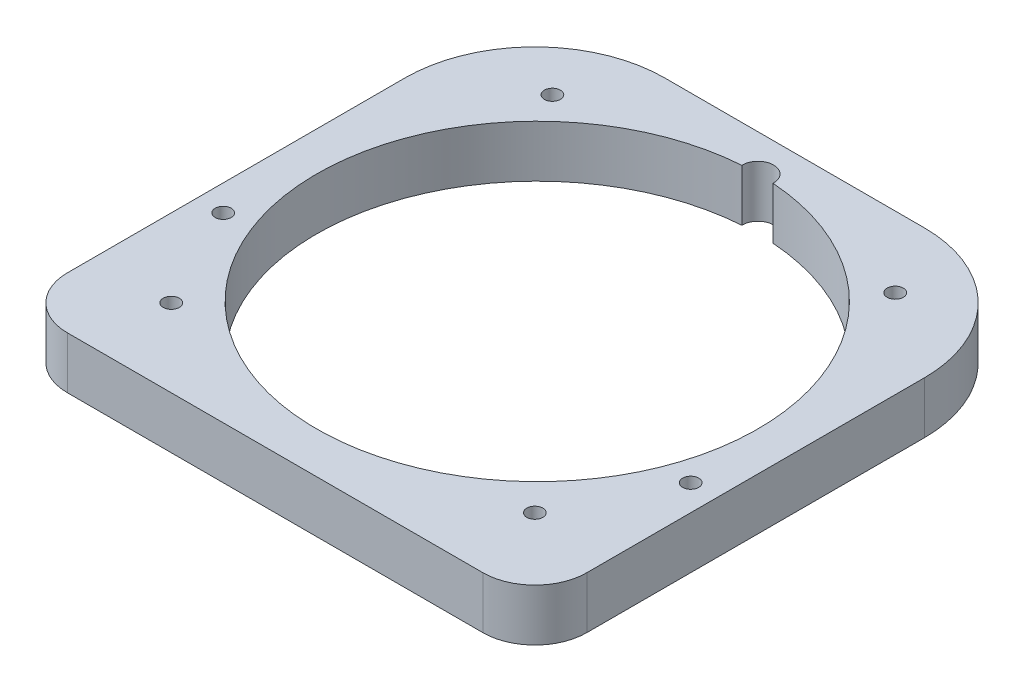
ISO-10303-21;
HEADER;
FILE_DESCRIPTION(('STEP AP214'),'2;1');
FILE_NAME('part.step','',(''),(''),'','','');
FILE_SCHEMA(('AUTOMOTIVE_DESIGN { 1 0 10303 214 1 1 1 1 }'));
ENDSEC;
DATA;
#1=APPLICATION_CONTEXT('core data for automotive mechanical design processes');
#2=APPLICATION_PROTOCOL_DEFINITION('international standard','automotive_design',2000,#1);
#3=PRODUCT_CONTEXT('',#1,'mechanical');
#4=PRODUCT('Part','Part','',(#3));
#5=PRODUCT_RELATED_PRODUCT_CATEGORY('part','',(#4));
#6=PRODUCT_DEFINITION_FORMATION('','',#4);
#7=PRODUCT_DEFINITION_CONTEXT('part definition',#1,'design');
#8=PRODUCT_DEFINITION('design','',#6,#7);
#9=PRODUCT_DEFINITION_SHAPE('','',#8);
#10=(LENGTH_UNIT() NAMED_UNIT(*) SI_UNIT(.MILLI.,.METRE.));
#11=(NAMED_UNIT(*) PLANE_ANGLE_UNIT() SI_UNIT($,.RADIAN.));
#12=(NAMED_UNIT(*) SI_UNIT($,.STERADIAN.) SOLID_ANGLE_UNIT());
#13=UNCERTAINTY_MEASURE_WITH_UNIT(LENGTH_MEASURE(1.E-05),#10,'distance_accuracy_value','');
#14=(GEOMETRIC_REPRESENTATION_CONTEXT(3) GLOBAL_UNCERTAINTY_ASSIGNED_CONTEXT((#13)) GLOBAL_UNIT_ASSIGNED_CONTEXT((#10,
#11,#12)) REPRESENTATION_CONTEXT('',''));
#15=CARTESIAN_POINT('',(0.,0.,0.));
#16=DIRECTION('',(0.,0.,1.));
#17=DIRECTION('',(1.,0.,0.));
#18=AXIS2_PLACEMENT_3D('',#15,#16,#17);
#19=CARTESIAN_POINT('',(10.,-10.,-10.));
#20=DIRECTION('',(0.,1.,0.));
#21=DIRECTION('',(0.,0.,1.));
#22=AXIS2_PLACEMENT_3D('',#19,#20,#21);
#23=CYLINDRICAL_SURFACE('',#22,10.);
#24=CARTESIAN_POINT('',(10.,0.,-10.));
#25=DIRECTION('',(0.,1.,0.));
#26=DIRECTION('',(0.,0.,1.));
#27=AXIS2_PLACEMENT_3D('',#24,#25,#26);
#28=CIRCLE('',#27,10.);
#29=CARTESIAN_POINT('',(0.,0.,-9.99999999999999));
#30=VERTEX_POINT('',#29);
#31=CARTESIAN_POINT('',(10.,0.,0.));
#32=VERTEX_POINT('',#31);
#33=EDGE_CURVE('E131',#30,#32,#28,.T.);
#34=ORIENTED_EDGE('',*,*,#33,.F.);
#35=DIRECTION('',(0.,1.,0.));
#36=VECTOR('',#35,1.);
#37=CARTESIAN_POINT('',(0.,-10.,-9.99999999999999));
#38=LINE('',#37,#36);
#39=CARTESIAN_POINT('',(0.,-10.,-9.99999999999999));
#40=VERTEX_POINT('',#39);
#41=EDGE_CURVE('E11',#40,#30,#38,.T.);
#42=ORIENTED_EDGE('',*,*,#41,.F.);
#43=CARTESIAN_POINT('',(10.,-10.,-10.));
#44=DIRECTION('',(0.,1.,0.));
#45=DIRECTION('',(0.,0.,1.));
#46=AXIS2_PLACEMENT_3D('',#43,#44,#45);
#47=CIRCLE('',#46,10.);
#48=CARTESIAN_POINT('',(10.,-10.,0.));
#49=VERTEX_POINT('',#48);
#50=EDGE_CURVE('E133',#40,#49,#47,.T.);
#51=ORIENTED_EDGE('',*,*,#50,.T.);
#52=DIRECTION('',(0.,1.,0.));
#53=VECTOR('',#52,1.);
#54=CARTESIAN_POINT('',(10.,-10.,0.));
#55=LINE('',#54,#53);
#56=EDGE_CURVE('E37',#49,#32,#55,.T.);
#57=ORIENTED_EDGE('',*,*,#56,.T.);
#58=EDGE_LOOP('',(#34,#42,#51,#57));
#59=FACE_BOUND('',#58,.T.);
#60=ADVANCED_FACE('F34',(#59),#23,.T.);
#61=CARTESIAN_POINT('',(0.,-10.,-75.));
#62=DIRECTION('',(-1.,0.,0.));
#63=DIRECTION('',(0.,0.,1.));
#64=AXIS2_PLACEMENT_3D('',#61,#62,#63);
#65=PLANE('',#64);
#66=DIRECTION('',(0.,0.,1.));
#67=VECTOR('',#66,1.);
#68=CARTESIAN_POINT('',(0.,0.,-75.));
#69=LINE('',#68,#67);
#70=CARTESIAN_POINT('',(0.,0.,-75.));
#71=VERTEX_POINT('',#70);
#72=EDGE_CURVE('E137',#71,#30,#69,.T.);
#73=ORIENTED_EDGE('',*,*,#72,.F.);
#74=DIRECTION('',(0.,1.,0.));
#75=VECTOR('',#74,1.);
#76=CARTESIAN_POINT('',(0.,-10.,-75.));
#77=LINE('',#76,#75);
#78=CARTESIAN_POINT('',(0.,-10.,-75.));
#79=VERTEX_POINT('',#78);
#80=EDGE_CURVE('E42',#79,#71,#77,.T.);
#81=ORIENTED_EDGE('',*,*,#80,.F.);
#82=DIRECTION('',(0.,0.,1.));
#83=VECTOR('',#82,1.);
#84=CARTESIAN_POINT('',(0.,-10.,-75.));
#85=LINE('',#84,#83);
#86=EDGE_CURVE('E155',#79,#40,#85,.T.);
#87=ORIENTED_EDGE('',*,*,#86,.T.);
#88=ORIENTED_EDGE('',*,*,#41,.T.);
#89=EDGE_LOOP('',(#73,#81,#87,#88));
#90=FACE_BOUND('',#89,.T.);
#91=ADVANCED_FACE('F202',(#90),#65,.T.);
#92=CARTESIAN_POINT('',(25.,-10.,-75.));
#93=DIRECTION('',(0.,1.,0.));
#94=DIRECTION('',(0.,0.,1.));
#95=AXIS2_PLACEMENT_3D('',#92,#93,#94);
#96=CYLINDRICAL_SURFACE('',#95,25.);
#97=CARTESIAN_POINT('',(25.,0.,-75.));
#98=DIRECTION('',(0.,1.,0.));
#99=DIRECTION('',(0.,0.,1.));
#100=AXIS2_PLACEMENT_3D('',#97,#98,#99);
#101=CIRCLE('',#100,25.);
#102=CARTESIAN_POINT('',(25.,0.,-100.));
#103=VERTEX_POINT('',#102);
#104=EDGE_CURVE('E175',#103,#71,#101,.T.);
#105=ORIENTED_EDGE('',*,*,#104,.F.);
#106=DIRECTION('',(0.,1.,0.));
#107=VECTOR('',#106,1.);
#108=CARTESIAN_POINT('',(25.,-10.,-100.));
#109=LINE('',#108,#107);
#110=CARTESIAN_POINT('',(25.,-10.,-100.));
#111=VERTEX_POINT('',#110);
#112=EDGE_CURVE('E181',#111,#103,#109,.T.);
#113=ORIENTED_EDGE('',*,*,#112,.F.);
#114=CARTESIAN_POINT('',(25.,-10.,-75.));
#115=DIRECTION('',(0.,1.,0.));
#116=DIRECTION('',(0.,0.,1.));
#117=AXIS2_PLACEMENT_3D('',#114,#115,#116);
#118=CIRCLE('',#117,25.);
#119=EDGE_CURVE('E152',#111,#79,#118,.T.);
#120=ORIENTED_EDGE('',*,*,#119,.T.);
#121=ORIENTED_EDGE('',*,*,#80,.T.);
#122=EDGE_LOOP('',(#105,#113,#120,#121));
#123=FACE_BOUND('',#122,.T.);
#124=ADVANCED_FACE('F221',(#123),#96,.T.);
#125=CARTESIAN_POINT('',(75.,-10.,-100.));
#126=DIRECTION('',(0.,0.,-1.));
#127=DIRECTION('',(-1.,0.,0.));
#128=AXIS2_PLACEMENT_3D('',#125,#126,#127);
#129=PLANE('',#128);
#130=DIRECTION('',(-1.,0.,0.));
#131=VECTOR('',#130,1.);
#132=CARTESIAN_POINT('',(75.,0.,-100.));
#133=LINE('',#132,#131);
#134=CARTESIAN_POINT('',(75.,0.,-100.));
#135=VERTEX_POINT('',#134);
#136=EDGE_CURVE('E172',#135,#103,#133,.T.);
#137=ORIENTED_EDGE('',*,*,#136,.F.);
#138=DIRECTION('',(0.,1.,0.));
#139=VECTOR('',#138,1.);
#140=CARTESIAN_POINT('',(75.,-10.,-100.));
#141=LINE('',#140,#139);
#142=CARTESIAN_POINT('',(75.,-10.,-100.));
#143=VERTEX_POINT('',#142);
#144=EDGE_CURVE('E183',#143,#135,#141,.T.);
#145=ORIENTED_EDGE('',*,*,#144,.F.);
#146=DIRECTION('',(-1.,0.,0.));
#147=VECTOR('',#146,1.);
#148=CARTESIAN_POINT('',(75.,-10.,-100.));
#149=LINE('',#148,#147);
#150=EDGE_CURVE('E149',#143,#111,#149,.T.);
#151=ORIENTED_EDGE('',*,*,#150,.T.);
#152=ORIENTED_EDGE('',*,*,#112,.T.);
#153=EDGE_LOOP('',(#137,#145,#151,#152));
#154=FACE_BOUND('',#153,.T.);
#155=ADVANCED_FACE('F219',(#154),#129,.T.);
#156=CARTESIAN_POINT('',(75.,-10.,-75.));
#157=DIRECTION('',(0.,1.,0.));
#158=DIRECTION('',(0.,0.,1.));
#159=AXIS2_PLACEMENT_3D('',#156,#157,#158);
#160=CYLINDRICAL_SURFACE('',#159,25.);
#161=CARTESIAN_POINT('',(75.,0.,-75.));
#162=DIRECTION('',(0.,1.,0.));
#163=DIRECTION('',(0.,0.,1.));
#164=AXIS2_PLACEMENT_3D('',#161,#162,#163);
#165=CIRCLE('',#164,25.);
#166=CARTESIAN_POINT('',(100.,0.,-75.));
#167=VERTEX_POINT('',#166);
#168=EDGE_CURVE('E169',#167,#135,#165,.T.);
#169=ORIENTED_EDGE('',*,*,#168,.F.);
#170=DIRECTION('',(0.,1.,0.));
#171=VECTOR('',#170,1.);
#172=CARTESIAN_POINT('',(100.,-10.,-75.));
#173=LINE('',#172,#171);
#174=CARTESIAN_POINT('',(100.,-10.,-75.));
#175=VERTEX_POINT('',#174);
#176=EDGE_CURVE('E185',#175,#167,#173,.T.);
#177=ORIENTED_EDGE('',*,*,#176,.F.);
#178=CARTESIAN_POINT('',(75.,-10.,-75.));
#179=DIRECTION('',(0.,1.,0.));
#180=DIRECTION('',(0.,0.,1.));
#181=AXIS2_PLACEMENT_3D('',#178,#179,#180);
#182=CIRCLE('',#181,25.);
#183=EDGE_CURVE('E146',#175,#143,#182,.T.);
#184=ORIENTED_EDGE('',*,*,#183,.T.);
#185=ORIENTED_EDGE('',*,*,#144,.T.);
#186=EDGE_LOOP('',(#169,#177,#184,#185));
#187=FACE_BOUND('',#186,.T.);
#188=ADVANCED_FACE('F215',(#187),#160,.T.);
#189=CARTESIAN_POINT('',(100.,-10.,-10.));
#190=DIRECTION('',(1.,0.,0.));
#191=DIRECTION('',(0.,0.,-1.));
#192=AXIS2_PLACEMENT_3D('',#189,#190,#191);
#193=PLANE('',#192);
#194=DIRECTION('',(0.,0.,-1.));
#195=VECTOR('',#194,1.);
#196=CARTESIAN_POINT('',(100.,0.,-10.));
#197=LINE('',#196,#195);
#198=CARTESIAN_POINT('',(100.,0.,-10.));
#199=VERTEX_POINT('',#198);
#200=EDGE_CURVE('E166',#199,#167,#197,.T.);
#201=ORIENTED_EDGE('',*,*,#200,.F.);
#202=DIRECTION('',(0.,1.,0.));
#203=VECTOR('',#202,1.);
#204=CARTESIAN_POINT('',(100.,-10.,-10.));
#205=LINE('',#204,#203);
#206=CARTESIAN_POINT('',(100.,-10.,-10.));
#207=VERTEX_POINT('',#206);
#208=EDGE_CURVE('E187',#207,#199,#205,.T.);
#209=ORIENTED_EDGE('',*,*,#208,.F.);
#210=DIRECTION('',(0.,0.,-1.));
#211=VECTOR('',#210,1.);
#212=CARTESIAN_POINT('',(100.,-10.,-10.));
#213=LINE('',#212,#211);
#214=EDGE_CURVE('E143',#207,#175,#213,.T.);
#215=ORIENTED_EDGE('',*,*,#214,.T.);
#216=ORIENTED_EDGE('',*,*,#176,.T.);
#217=EDGE_LOOP('',(#201,#209,#215,#216));
#218=FACE_BOUND('',#217,.T.);
#219=ADVANCED_FACE('F213',(#218),#193,.T.);
#220=CARTESIAN_POINT('',(90.,-10.,-10.));
#221=DIRECTION('',(0.,1.,0.));
#222=DIRECTION('',(0.,0.,1.));
#223=AXIS2_PLACEMENT_3D('',#220,#221,#222);
#224=CYLINDRICAL_SURFACE('',#223,10.);
#225=CARTESIAN_POINT('',(90.,0.,-10.));
#226=DIRECTION('',(0.,1.,0.));
#227=DIRECTION('',(0.,0.,1.));
#228=AXIS2_PLACEMENT_3D('',#225,#226,#227);
#229=CIRCLE('',#228,10.);
#230=CARTESIAN_POINT('',(90.,0.,0.));
#231=VERTEX_POINT('',#230);
#232=EDGE_CURVE('E163',#231,#199,#229,.T.);
#233=ORIENTED_EDGE('',*,*,#232,.F.);
#234=DIRECTION('',(0.,1.,0.));
#235=VECTOR('',#234,1.);
#236=CARTESIAN_POINT('',(90.,-10.,0.));
#237=LINE('',#236,#235);
#238=CARTESIAN_POINT('',(90.,-10.,0.));
#239=VERTEX_POINT('',#238);
#240=EDGE_CURVE('E188',#239,#231,#237,.T.);
#241=ORIENTED_EDGE('',*,*,#240,.F.);
#242=CARTESIAN_POINT('',(90.,-10.,-10.));
#243=DIRECTION('',(0.,1.,0.));
#244=DIRECTION('',(0.,0.,1.));
#245=AXIS2_PLACEMENT_3D('',#242,#243,#244);
#246=CIRCLE('',#245,10.);
#247=EDGE_CURVE('E140',#239,#207,#246,.T.);
#248=ORIENTED_EDGE('',*,*,#247,.T.);
#249=ORIENTED_EDGE('',*,*,#208,.T.);
#250=EDGE_LOOP('',(#233,#241,#248,#249));
#251=FACE_BOUND('',#250,.T.);
#252=ADVANCED_FACE('F209',(#251),#224,.T.);
#253=CARTESIAN_POINT('',(10.,-10.,0.));
#254=DIRECTION('',(0.,0.,1.));
#255=DIRECTION('',(1.,0.,0.));
#256=AXIS2_PLACEMENT_3D('',#253,#254,#255);
#257=PLANE('',#256);
#258=DIRECTION('',(1.,0.,0.));
#259=VECTOR('',#258,1.);
#260=CARTESIAN_POINT('',(10.,0.,0.));
#261=LINE('',#260,#259);
#262=EDGE_CURVE('E160',#32,#231,#261,.T.);
#263=ORIENTED_EDGE('',*,*,#262,.F.);
#264=ORIENTED_EDGE('',*,*,#56,.F.);
#265=DIRECTION('',(1.,0.,0.));
#266=VECTOR('',#265,1.);
#267=CARTESIAN_POINT('',(10.,-10.,0.));
#268=LINE('',#267,#266);
#269=EDGE_CURVE('E136',#49,#239,#268,.T.);
#270=ORIENTED_EDGE('',*,*,#269,.T.);
#271=ORIENTED_EDGE('',*,*,#240,.T.);
#272=EDGE_LOOP('',(#263,#264,#270,#271));
#273=FACE_BOUND('',#272,.T.);
#274=ADVANCED_FACE('F196',(#273),#257,.T.);
#275=CARTESIAN_POINT('',(10.,-10.,-10.));
#276=DIRECTION('',(0.,1.,0.));
#277=DIRECTION('',(0.,0.,1.));
#278=AXIS2_PLACEMENT_3D('',#275,#276,#277);
#279=PLANE('',#278);
#280=CARTESIAN_POINT('',(14.9999999999983,-10.,-15.0000000000126));
#281=DIRECTION('',(0.,1.,0.));
#282=DIRECTION('',(0.,0.,1.));
#283=AXIS2_PLACEMENT_3D('',#280,#281,#282);
#284=CIRCLE('',#283,1.55);
#285=CARTESIAN_POINT('',(14.9999999999983,-10.,-13.4500000000126));
#286=VERTEX_POINT('',#285);
#287=EDGE_CURVE('E379',#286,#286,#284,.T.);
#288=ORIENTED_EDGE('',*,*,#287,.T.);
#289=EDGE_LOOP('',(#288));
#290=FACE_BOUND('',#289,.T.);
#291=CARTESIAN_POINT('',(16.9999999999983,-10.,-86.3783455371568));
#292=DIRECTION('',(0.,1.,0.));
#293=DIRECTION('',(0.,0.,1.));
#294=AXIS2_PLACEMENT_3D('',#291,#292,#293);
#295=CIRCLE('',#294,1.55);
#296=CARTESIAN_POINT('',(16.9999999999983,-10.,-84.8283455371568));
#297=VERTEX_POINT('',#296);
#298=EDGE_CURVE('E387',#297,#297,#295,.T.);
#299=ORIENTED_EDGE('',*,*,#298,.T.);
#300=EDGE_LOOP('',(#299));
#301=FACE_BOUND('',#300,.T.);
#302=CARTESIAN_POINT('',(85.000000000062,-10.,-15.0000000000045));
#303=DIRECTION('',(0.,1.,0.));
#304=DIRECTION('',(0.,0.,1.));
#305=AXIS2_PLACEMENT_3D('',#302,#303,#304);
#306=CIRCLE('',#305,1.54999999998706);
#307=CARTESIAN_POINT('',(85.000000000062,-10.,-13.4500000000175));
#308=VERTEX_POINT('',#307);
#309=EDGE_CURVE('E393',#308,#308,#306,.T.);
#310=ORIENTED_EDGE('',*,*,#309,.T.);
#311=EDGE_LOOP('',(#310));
#312=FACE_BOUND('',#311,.T.);
#313=CARTESIAN_POINT('',(83.0000000000623,-10.,-86.3783455371487));
#314=DIRECTION('',(0.,1.,0.));
#315=DIRECTION('',(0.,0.,1.));
#316=AXIS2_PLACEMENT_3D('',#313,#314,#315);
#317=CIRCLE('',#316,1.54999999998685);
#318=CARTESIAN_POINT('',(83.0000000000623,-10.,-84.8283455371619));
#319=VERTEX_POINT('',#318);
#320=EDGE_CURVE('E399',#319,#319,#317,.T.);
#321=ORIENTED_EDGE('',*,*,#320,.T.);
#322=EDGE_LOOP('',(#321));
#323=FACE_BOUND('',#322,.T.);
#324=CARTESIAN_POINT('',(5.00000000000001,-10.,-35.));
#325=DIRECTION('',(0.,1.,0.));
#326=DIRECTION('',(0.,0.,1.));
#327=AXIS2_PLACEMENT_3D('',#324,#325,#326);
#328=CIRCLE('',#327,1.55);
#329=CARTESIAN_POINT('',(5.00000000000001,-10.,-33.45));
#330=VERTEX_POINT('',#329);
#331=EDGE_CURVE('E405',#330,#330,#328,.T.);
#332=ORIENTED_EDGE('',*,*,#331,.T.);
#333=EDGE_LOOP('',(#332));
#334=FACE_BOUND('',#333,.T.);
#335=CARTESIAN_POINT('',(95.,-10.,-35.));
#336=DIRECTION('',(0.,1.,0.));
#337=DIRECTION('',(0.,0.,1.));
#338=AXIS2_PLACEMENT_3D('',#335,#336,#337);
#339=CIRCLE('',#338,1.54999999999999);
#340=CARTESIAN_POINT('',(95.,-10.,-33.45));
#341=VERTEX_POINT('',#340);
#342=EDGE_CURVE('E129',#341,#341,#339,.T.);
#343=ORIENTED_EDGE('',*,*,#342,.T.);
#344=EDGE_LOOP('',(#343));
#345=FACE_BOUND('',#344,.T.);
#346=CARTESIAN_POINT('',(50.0000000000398,-10.,-50.4618580463456));
#347=DIRECTION('',(0.,1.,0.));
#348=DIRECTION('',(0.,0.,1.));
#349=AXIS2_PLACEMENT_3D('',#346,#347,#348);
#350=CIRCLE('',#349,42.5);
#351=CARTESIAN_POINT('',(47.0018690944028,-10.,-92.8559756934044));
#352=VERTEX_POINT('',#351);
#353=CARTESIAN_POINT('',(52.9981309056768,-10.,-92.8559756934044));
#354=VERTEX_POINT('',#353);
#355=EDGE_CURVE('E114',#352,#354,#350,.T.);
#356=ORIENTED_EDGE('',*,*,#355,.T.);
#357=CARTESIAN_POINT('',(50.0000000000398,-10.,-92.9618580463456));
#358=DIRECTION('',(0.,1.,0.));
#359=DIRECTION('',(0.,0.,1.));
#360=AXIS2_PLACEMENT_3D('',#357,#358,#359);
#361=CIRCLE('',#360,3.);
#362=EDGE_CURVE('E50',#354,#352,#361,.T.);
#363=ORIENTED_EDGE('',*,*,#362,.T.);
#364=EDGE_LOOP('',(#356,#363));
#365=FACE_BOUND('',#364,.T.);
#366=ORIENTED_EDGE('',*,*,#50,.F.);
#367=ORIENTED_EDGE('',*,*,#86,.F.);
#368=ORIENTED_EDGE('',*,*,#119,.F.);
#369=ORIENTED_EDGE('',*,*,#150,.F.);
#370=ORIENTED_EDGE('',*,*,#183,.F.);
#371=ORIENTED_EDGE('',*,*,#214,.F.);
#372=ORIENTED_EDGE('',*,*,#247,.F.);
#373=ORIENTED_EDGE('',*,*,#269,.F.);
#374=EDGE_LOOP('',(#366,#367,#368,#369,#370,#371,#372,#373));
#375=FACE_BOUND('',#374,.T.);
#376=ADVANCED_FACE('F120',(#290,#301,#312,#323,#334,#345,#365,#375),#279,.F.);
#377=CARTESIAN_POINT('',(10.,0.,-10.));
#378=DIRECTION('',(0.,1.,0.));
#379=DIRECTION('',(0.,0.,1.));
#380=AXIS2_PLACEMENT_3D('',#377,#378,#379);
#381=PLANE('',#380);
#382=CARTESIAN_POINT('',(14.9999999999983,0.,-15.0000000000126));
#383=DIRECTION('',(0.,1.,0.));
#384=DIRECTION('',(0.,0.,1.));
#385=AXIS2_PLACEMENT_3D('',#382,#383,#384);
#386=CIRCLE('',#385,1.55);
#387=CARTESIAN_POINT('',(14.9999999999983,0.,-13.4500000000126));
#388=VERTEX_POINT('',#387);
#389=EDGE_CURVE('E382',#388,#388,#386,.T.);
#390=ORIENTED_EDGE('',*,*,#389,.F.);
#391=EDGE_LOOP('',(#390));
#392=FACE_BOUND('',#391,.T.);
#393=CARTESIAN_POINT('',(16.9999999999983,0.,-86.3783455371568));
#394=DIRECTION('',(0.,1.,0.));
#395=DIRECTION('',(0.,0.,1.));
#396=AXIS2_PLACEMENT_3D('',#393,#394,#395);
#397=CIRCLE('',#396,1.55);
#398=CARTESIAN_POINT('',(16.9999999999983,0.,-84.8283455371568));
#399=VERTEX_POINT('',#398);
#400=EDGE_CURVE('E384',#399,#399,#397,.T.);
#401=ORIENTED_EDGE('',*,*,#400,.F.);
#402=EDGE_LOOP('',(#401));
#403=FACE_BOUND('',#402,.T.);
#404=CARTESIAN_POINT('',(85.000000000062,0.,-15.0000000000045));
#405=DIRECTION('',(0.,1.,0.));
#406=DIRECTION('',(0.,0.,1.));
#407=AXIS2_PLACEMENT_3D('',#404,#405,#406);
#408=CIRCLE('',#407,1.54999999998706);
#409=CARTESIAN_POINT('',(85.000000000062,0.,-13.4500000000175));
#410=VERTEX_POINT('',#409);
#411=EDGE_CURVE('E390',#410,#410,#408,.T.);
#412=ORIENTED_EDGE('',*,*,#411,.F.);
#413=EDGE_LOOP('',(#412));
#414=FACE_BOUND('',#413,.T.);
#415=CARTESIAN_POINT('',(83.0000000000623,0.,-86.3783455371487));
#416=DIRECTION('',(0.,1.,0.));
#417=DIRECTION('',(0.,0.,1.));
#418=AXIS2_PLACEMENT_3D('',#415,#416,#417);
#419=CIRCLE('',#418,1.54999999998685);
#420=CARTESIAN_POINT('',(83.0000000000623,0.,-84.8283455371619));
#421=VERTEX_POINT('',#420);
#422=EDGE_CURVE('E396',#421,#421,#419,.T.);
#423=ORIENTED_EDGE('',*,*,#422,.F.);
#424=EDGE_LOOP('',(#423));
#425=FACE_BOUND('',#424,.T.);
#426=CARTESIAN_POINT('',(5.00000000000001,0.,-35.));
#427=DIRECTION('',(0.,1.,0.));
#428=DIRECTION('',(0.,0.,1.));
#429=AXIS2_PLACEMENT_3D('',#426,#427,#428);
#430=CIRCLE('',#429,1.55);
#431=CARTESIAN_POINT('',(5.00000000000001,0.,-33.45));
#432=VERTEX_POINT('',#431);
#433=EDGE_CURVE('E402',#432,#432,#430,.T.);
#434=ORIENTED_EDGE('',*,*,#433,.F.);
#435=EDGE_LOOP('',(#434));
#436=FACE_BOUND('',#435,.T.);
#437=CARTESIAN_POINT('',(95.,0.,-35.));
#438=DIRECTION('',(0.,1.,0.));
#439=DIRECTION('',(0.,0.,1.));
#440=AXIS2_PLACEMENT_3D('',#437,#438,#439);
#441=CIRCLE('',#440,1.54999999999999);
#442=CARTESIAN_POINT('',(95.,0.,-33.45));
#443=VERTEX_POINT('',#442);
#444=EDGE_CURVE('E126',#443,#443,#441,.T.);
#445=ORIENTED_EDGE('',*,*,#444,.F.);
#446=EDGE_LOOP('',(#445));
#447=FACE_BOUND('',#446,.T.);
#448=CARTESIAN_POINT('',(50.0000000000398,0.,-92.9618580463456));
#449=DIRECTION('',(0.,1.,0.));
#450=DIRECTION('',(0.,0.,1.));
#451=AXIS2_PLACEMENT_3D('',#448,#449,#450);
#452=CIRCLE('',#451,3.);
#453=CARTESIAN_POINT('',(52.9981309056768,0.,-92.8559756934044));
#454=VERTEX_POINT('',#453);
#455=CARTESIAN_POINT('',(47.0018690944028,0.,-92.8559756934044));
#456=VERTEX_POINT('',#455);
#457=EDGE_CURVE('E55',#454,#456,#452,.T.);
#458=ORIENTED_EDGE('',*,*,#457,.F.);
#459=CARTESIAN_POINT('',(50.0000000000398,0.,-50.4618580463456));
#460=DIRECTION('',(0.,1.,0.));
#461=DIRECTION('',(0.,0.,1.));
#462=AXIS2_PLACEMENT_3D('',#459,#460,#461);
#463=CIRCLE('',#462,42.5);
#464=EDGE_CURVE('E122',#456,#454,#463,.T.);
#465=ORIENTED_EDGE('',*,*,#464,.F.);
#466=EDGE_LOOP('',(#458,#465));
#467=FACE_BOUND('',#466,.T.);
#468=ORIENTED_EDGE('',*,*,#33,.T.);
#469=ORIENTED_EDGE('',*,*,#262,.T.);
#470=ORIENTED_EDGE('',*,*,#232,.T.);
#471=ORIENTED_EDGE('',*,*,#200,.T.);
#472=ORIENTED_EDGE('',*,*,#168,.T.);
#473=ORIENTED_EDGE('',*,*,#136,.T.);
#474=ORIENTED_EDGE('',*,*,#104,.T.);
#475=ORIENTED_EDGE('',*,*,#72,.T.);
#476=EDGE_LOOP('',(#468,#469,#470,#471,#472,#473,#474,#475));
#477=FACE_BOUND('',#476,.T.);
#478=ADVANCED_FACE('F198',(#392,#403,#414,#425,#436,#447,#467,#477),#381,.T.);
#479=CARTESIAN_POINT('',(50.0000000000398,-10.,-92.9618580463456));
#480=DIRECTION('',(0.,1.,0.));
#481=DIRECTION('',(0.,0.,1.));
#482=AXIS2_PLACEMENT_3D('',#479,#480,#481);
#483=CYLINDRICAL_SURFACE('',#482,3.);
#484=ORIENTED_EDGE('',*,*,#457,.T.);
#485=DIRECTION('',(0.,1.,0.));
#486=VECTOR('',#485,1.);
#487=CARTESIAN_POINT('',(47.0018690944028,-10.,-92.8559756934044));
#488=LINE('',#487,#486);
#489=EDGE_CURVE('E107',#352,#456,#488,.T.);
#490=ORIENTED_EDGE('',*,*,#489,.F.);
#491=ORIENTED_EDGE('',*,*,#362,.F.);
#492=DIRECTION('',(0.,1.,0.));
#493=VECTOR('',#492,1.);
#494=CARTESIAN_POINT('',(52.9981309056768,-10.,-92.8559756934044));
#495=LINE('',#494,#493);
#496=EDGE_CURVE('E113',#354,#454,#495,.T.);
#497=ORIENTED_EDGE('',*,*,#496,.T.);
#498=EDGE_LOOP('',(#484,#490,#491,#497));
#499=FACE_BOUND('',#498,.T.);
#500=ADVANCED_FACE('F109',(#499),#483,.F.);
#501=CARTESIAN_POINT('',(50.0000000000398,-10.,-50.4618580463456));
#502=DIRECTION('',(0.,1.,0.));
#503=DIRECTION('',(0.,0.,1.));
#504=AXIS2_PLACEMENT_3D('',#501,#502,#503);
#505=CYLINDRICAL_SURFACE('',#504,42.5);
#506=ORIENTED_EDGE('',*,*,#464,.T.);
#507=ORIENTED_EDGE('',*,*,#496,.F.);
#508=ORIENTED_EDGE('',*,*,#355,.F.);
#509=ORIENTED_EDGE('',*,*,#489,.T.);
#510=EDGE_LOOP('',(#506,#507,#508,#509));
#511=FACE_BOUND('',#510,.T.);
#512=ADVANCED_FACE('F117',(#511),#505,.F.);
#513=CARTESIAN_POINT('',(95.,-10.,-35.));
#514=DIRECTION('',(0.,1.,0.));
#515=DIRECTION('',(0.,0.,1.));
#516=AXIS2_PLACEMENT_3D('',#513,#514,#515);
#517=CYLINDRICAL_SURFACE('',#516,1.54999999999999);
#518=ORIENTED_EDGE('',*,*,#342,.F.);
#519=EDGE_LOOP('',(#518));
#520=FACE_BOUND('',#519,.T.);
#521=ORIENTED_EDGE('',*,*,#444,.T.);
#522=EDGE_LOOP('',(#521));
#523=FACE_BOUND('',#522,.T.);
#524=ADVANCED_FACE('F299',(#520,#523),#517,.F.);
#525=CARTESIAN_POINT('',(5.00000000000001,-10.,-35.));
#526=DIRECTION('',(0.,1.,0.));
#527=DIRECTION('',(0.,0.,1.));
#528=AXIS2_PLACEMENT_3D('',#525,#526,#527);
#529=CYLINDRICAL_SURFACE('',#528,1.55);
#530=ORIENTED_EDGE('',*,*,#331,.F.);
#531=EDGE_LOOP('',(#530));
#532=FACE_BOUND('',#531,.T.);
#533=ORIENTED_EDGE('',*,*,#433,.T.);
#534=EDGE_LOOP('',(#533));
#535=FACE_BOUND('',#534,.T.);
#536=ADVANCED_FACE('F322',(#532,#535),#529,.F.);
#537=CARTESIAN_POINT('',(83.0000000000623,-10.,-86.3783455371487));
#538=DIRECTION('',(0.,1.,0.));
#539=DIRECTION('',(0.,0.,1.));
#540=AXIS2_PLACEMENT_3D('',#537,#538,#539);
#541=CYLINDRICAL_SURFACE('',#540,1.54999999998685);
#542=ORIENTED_EDGE('',*,*,#320,.F.);
#543=EDGE_LOOP('',(#542));
#544=FACE_BOUND('',#543,.T.);
#545=ORIENTED_EDGE('',*,*,#422,.T.);
#546=EDGE_LOOP('',(#545));
#547=FACE_BOUND('',#546,.T.);
#548=ADVANCED_FACE('F332',(#544,#547),#541,.F.);
#549=CARTESIAN_POINT('',(85.000000000062,-10.,-15.0000000000045));
#550=DIRECTION('',(0.,1.,0.));
#551=DIRECTION('',(0.,0.,1.));
#552=AXIS2_PLACEMENT_3D('',#549,#550,#551);
#553=CYLINDRICAL_SURFACE('',#552,1.54999999998706);
#554=ORIENTED_EDGE('',*,*,#309,.F.);
#555=EDGE_LOOP('',(#554));
#556=FACE_BOUND('',#555,.T.);
#557=ORIENTED_EDGE('',*,*,#411,.T.);
#558=EDGE_LOOP('',(#557));
#559=FACE_BOUND('',#558,.T.);
#560=ADVANCED_FACE('F342',(#556,#559),#553,.F.);
#561=CARTESIAN_POINT('',(16.9999999999983,-10.,-86.3783455371568));
#562=DIRECTION('',(0.,1.,0.));
#563=DIRECTION('',(0.,0.,1.));
#564=AXIS2_PLACEMENT_3D('',#561,#562,#563);
#565=CYLINDRICAL_SURFACE('',#564,1.55);
#566=ORIENTED_EDGE('',*,*,#298,.F.);
#567=EDGE_LOOP('',(#566));
#568=FACE_BOUND('',#567,.T.);
#569=ORIENTED_EDGE('',*,*,#400,.T.);
#570=EDGE_LOOP('',(#569));
#571=FACE_BOUND('',#570,.T.);
#572=ADVANCED_FACE('F352',(#568,#571),#565,.F.);
#573=CARTESIAN_POINT('',(14.9999999999983,-10.,-15.0000000000126));
#574=DIRECTION('',(0.,1.,0.));
#575=DIRECTION('',(0.,0.,1.));
#576=AXIS2_PLACEMENT_3D('',#573,#574,#575);
#577=CYLINDRICAL_SURFACE('',#576,1.55);
#578=ORIENTED_EDGE('',*,*,#287,.F.);
#579=EDGE_LOOP('',(#578));
#580=FACE_BOUND('',#579,.T.);
#581=ORIENTED_EDGE('',*,*,#389,.T.);
#582=EDGE_LOOP('',(#581));
#583=FACE_BOUND('',#582,.T.);
#584=ADVANCED_FACE('F362',(#580,#583),#577,.F.);
#585=CLOSED_SHELL('',(#60,#91,#124,#155,#188,#219,#252,#274,#376,#478,#500,#512,#524,#536,#548,
#560,#572,#584));
#586=MANIFOLD_SOLID_BREP('B2',#585);
#587=ADVANCED_BREP_SHAPE_REPRESENTATION('',(#18,#586),#14);
#588=SHAPE_DEFINITION_REPRESENTATION(#9,#587);
ENDSEC;
END-ISO-10303-21;
